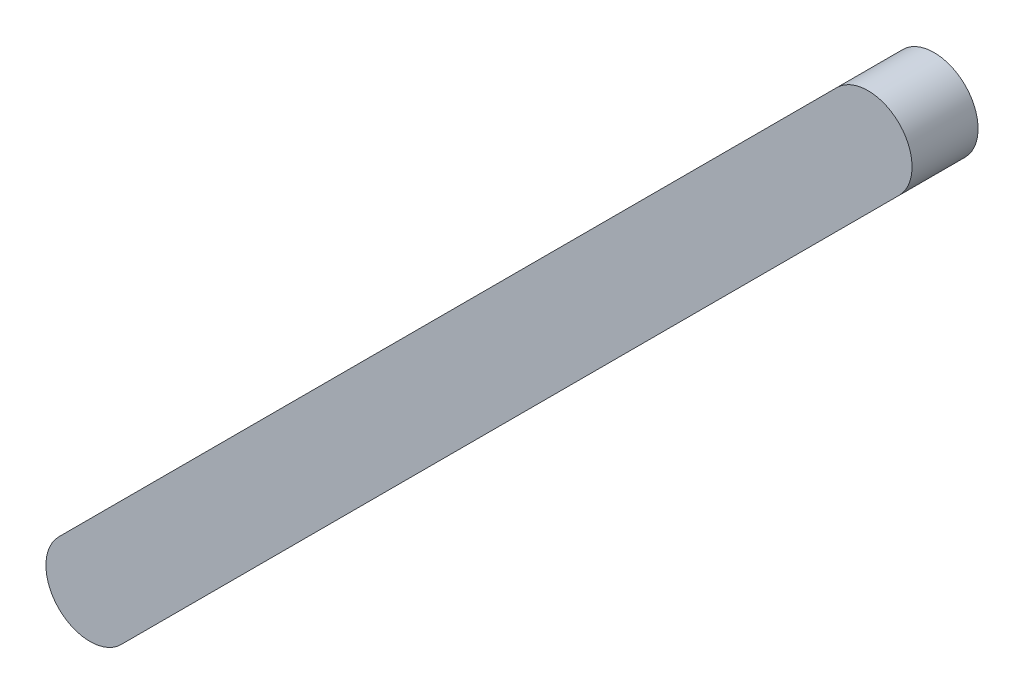
ISO-10303-21;
HEADER;
FILE_DESCRIPTION(('STEP AP214'),'2;1');
FILE_NAME('part.step','',(''),(''),'','','');
FILE_SCHEMA(('AUTOMOTIVE_DESIGN { 1 0 10303 214 1 1 1 1 }'));
ENDSEC;
DATA;
#1=APPLICATION_CONTEXT('core data for automotive mechanical design processes');
#2=APPLICATION_PROTOCOL_DEFINITION('international standard','automotive_design',2000,#1);
#3=PRODUCT_CONTEXT('',#1,'mechanical');
#4=PRODUCT('Part','Part','',(#3));
#5=PRODUCT_RELATED_PRODUCT_CATEGORY('part','',(#4));
#6=PRODUCT_DEFINITION_FORMATION('','',#4);
#7=PRODUCT_DEFINITION_CONTEXT('part definition',#1,'design');
#8=PRODUCT_DEFINITION('design','',#6,#7);
#9=PRODUCT_DEFINITION_SHAPE('','',#8);
#10=(LENGTH_UNIT() NAMED_UNIT(*) SI_UNIT(.MILLI.,.METRE.));
#11=(NAMED_UNIT(*) PLANE_ANGLE_UNIT() SI_UNIT($,.RADIAN.));
#12=(NAMED_UNIT(*) SI_UNIT($,.STERADIAN.) SOLID_ANGLE_UNIT());
#13=UNCERTAINTY_MEASURE_WITH_UNIT(LENGTH_MEASURE(1.E-05),#10,'distance_accuracy_value','');
#14=(GEOMETRIC_REPRESENTATION_CONTEXT(3) GLOBAL_UNCERTAINTY_ASSIGNED_CONTEXT((#13)) GLOBAL_UNIT_ASSIGNED_CONTEXT((#10,
#11,#12)) REPRESENTATION_CONTEXT('',''));
#15=CARTESIAN_POINT('',(0.,0.,0.));
#16=DIRECTION('',(0.,0.,1.));
#17=DIRECTION('',(1.,0.,0.));
#18=AXIS2_PLACEMENT_3D('',#15,#16,#17);
#19=CARTESIAN_POINT('',(0.,0.,3.));
#20=DIRECTION('',(0.,0.,-1.));
#21=DIRECTION('',(-1.,0.,0.));
#22=AXIS2_PLACEMENT_3D('',#19,#20,#21);
#23=CYLINDRICAL_SURFACE('',#22,2.);
#24=CARTESIAN_POINT('',(0.,0.,0.));
#25=DIRECTION('',(0.,0.,1.));
#26=DIRECTION('',(1.,0.,0.));
#27=AXIS2_PLACEMENT_3D('',#24,#25,#26);
#28=CIRCLE('',#27,2.);
#29=CARTESIAN_POINT('',(-1.4142135623731,1.41421356237309,0.));
#30=VERTEX_POINT('',#29);
#31=CARTESIAN_POINT('',(1.4142135623731,-1.41421356237309,0.));
#32=VERTEX_POINT('',#31);
#33=EDGE_CURVE('E100',#30,#32,#28,.T.);
#34=ORIENTED_EDGE('',*,*,#33,.T.);
#35=DIRECTION('',(0.,0.,-1.));
#36=VECTOR('',#35,1.);
#37=CARTESIAN_POINT('',(1.4142135623731,-1.41421356237309,3.));
#38=LINE('',#37,#36);
#39=CARTESIAN_POINT('',(1.4142135623731,-1.41421356237309,3.));
#40=VERTEX_POINT('',#39);
#41=EDGE_CURVE('E11',#40,#32,#38,.T.);
#42=ORIENTED_EDGE('',*,*,#41,.F.);
#43=CARTESIAN_POINT('',(0.,0.,3.));
#44=DIRECTION('',(0.,0.,1.));
#45=DIRECTION('',(1.,0.,0.));
#46=AXIS2_PLACEMENT_3D('',#43,#44,#45);
#47=CIRCLE('',#46,2.);
#48=CARTESIAN_POINT('',(-1.4142135623731,1.41421356237309,3.));
#49=VERTEX_POINT('',#48);
#50=EDGE_CURVE('E88',#49,#40,#47,.T.);
#51=ORIENTED_EDGE('',*,*,#50,.F.);
#52=DIRECTION('',(0.,0.,-1.));
#53=VECTOR('',#52,1.);
#54=CARTESIAN_POINT('',(-1.4142135623731,1.41421356237309,3.));
#55=LINE('',#54,#53);
#56=EDGE_CURVE('E96',#49,#30,#55,.T.);
#57=ORIENTED_EDGE('',*,*,#56,.T.);
#58=EDGE_LOOP('',(#34,#42,#51,#57));
#59=FACE_BOUND('',#58,.T.);
#60=ADVANCED_FACE('F37',(#59),#23,.T.);
#61=CARTESIAN_POINT('',(1.4142135623731,-1.41421356237309,3.));
#62=DIRECTION('',(-0.707106781186549,0.707106781186546,0.));
#63=DIRECTION('',(-0.707106781186546,-0.707106781186549,0.));
#64=AXIS2_PLACEMENT_3D('',#61,#62,#63);
#65=PLANE('',#64);
#66=DIRECTION('',(0.707106781186546,0.707106781186549,0.));
#67=VECTOR('',#66,1.);
#68=CARTESIAN_POINT('',(1.4142135623731,-1.41421356237309,0.));
#69=LINE('',#68,#67);
#70=CARTESIAN_POINT('',(36.7695526217004,33.9411254969544,0.));
#71=VERTEX_POINT('',#70);
#72=EDGE_CURVE('E92',#32,#71,#69,.T.);
#73=ORIENTED_EDGE('',*,*,#72,.T.);
#74=DIRECTION('',(0.,0.,-1.));
#75=VECTOR('',#74,1.);
#76=CARTESIAN_POINT('',(36.7695526217004,33.9411254969544,3.));
#77=LINE('',#76,#75);
#78=CARTESIAN_POINT('',(36.7695526217004,33.9411254969544,3.));
#79=VERTEX_POINT('',#78);
#80=EDGE_CURVE('E45',#79,#71,#77,.T.);
#81=ORIENTED_EDGE('',*,*,#80,.F.);
#82=DIRECTION('',(0.707106781186546,0.707106781186549,0.));
#83=VECTOR('',#82,1.);
#84=CARTESIAN_POINT('',(1.4142135623731,-1.41421356237309,3.));
#85=LINE('',#84,#83);
#86=EDGE_CURVE('E83',#40,#79,#85,.T.);
#87=ORIENTED_EDGE('',*,*,#86,.F.);
#88=ORIENTED_EDGE('',*,*,#41,.T.);
#89=EDGE_LOOP('',(#73,#81,#87,#88));
#90=FACE_BOUND('',#89,.T.);
#91=ADVANCED_FACE('F91',(#90),#65,.F.);
#92=CARTESIAN_POINT('',(35.3553390593273,35.3553390593274,3.));
#93=DIRECTION('',(0.,0.,-1.));
#94=DIRECTION('',(-1.,0.,0.));
#95=AXIS2_PLACEMENT_3D('',#92,#93,#94);
#96=CYLINDRICAL_SURFACE('',#95,2.);
#97=CARTESIAN_POINT('',(35.3553390593273,35.3553390593274,0.));
#98=DIRECTION('',(0.,0.,1.));
#99=DIRECTION('',(1.,0.,0.));
#100=AXIS2_PLACEMENT_3D('',#97,#98,#99);
#101=CIRCLE('',#100,2.);
#102=CARTESIAN_POINT('',(33.9411254969542,36.7695526217005,0.));
#103=VERTEX_POINT('',#102);
#104=EDGE_CURVE('E70',#71,#103,#101,.T.);
#105=ORIENTED_EDGE('',*,*,#104,.T.);
#106=DIRECTION('',(0.,0.,-1.));
#107=VECTOR('',#106,1.);
#108=CARTESIAN_POINT('',(33.9411254969542,36.7695526217005,3.));
#109=LINE('',#108,#107);
#110=CARTESIAN_POINT('',(33.9411254969542,36.7695526217005,3.));
#111=VERTEX_POINT('',#110);
#112=EDGE_CURVE('E93',#111,#103,#109,.T.);
#113=ORIENTED_EDGE('',*,*,#112,.F.);
#114=CARTESIAN_POINT('',(35.3553390593273,35.3553390593274,3.));
#115=DIRECTION('',(0.,0.,1.));
#116=DIRECTION('',(1.,0.,0.));
#117=AXIS2_PLACEMENT_3D('',#114,#115,#116);
#118=CIRCLE('',#117,2.);
#119=EDGE_CURVE('E86',#79,#111,#118,.T.);
#120=ORIENTED_EDGE('',*,*,#119,.F.);
#121=ORIENTED_EDGE('',*,*,#80,.T.);
#122=EDGE_LOOP('',(#105,#113,#120,#121));
#123=FACE_BOUND('',#122,.T.);
#124=ADVANCED_FACE('F94',(#123),#96,.T.);
#125=CARTESIAN_POINT('',(-1.4142135623731,1.41421356237309,3.));
#126=DIRECTION('',(0.707106781186549,-0.707106781186546,0.));
#127=DIRECTION('',(0.707106781186546,0.707106781186549,0.));
#128=AXIS2_PLACEMENT_3D('',#125,#126,#127);
#129=PLANE('',#128);
#130=DIRECTION('',(-0.707106781186546,-0.707106781186549,0.));
#131=VECTOR('',#130,1.);
#132=CARTESIAN_POINT('',(-1.4142135623731,1.41421356237309,0.));
#133=LINE('',#132,#131);
#134=EDGE_CURVE('E76',#103,#30,#133,.T.);
#135=ORIENTED_EDGE('',*,*,#134,.T.);
#136=ORIENTED_EDGE('',*,*,#56,.F.);
#137=DIRECTION('',(-0.707106781186546,-0.707106781186549,0.));
#138=VECTOR('',#137,1.);
#139=CARTESIAN_POINT('',(-1.4142135623731,1.41421356237309,3.));
#140=LINE('',#139,#138);
#141=EDGE_CURVE('E53',#111,#49,#140,.T.);
#142=ORIENTED_EDGE('',*,*,#141,.F.);
#143=ORIENTED_EDGE('',*,*,#112,.T.);
#144=EDGE_LOOP('',(#135,#136,#142,#143));
#145=FACE_BOUND('',#144,.T.);
#146=ADVANCED_FACE('F107',(#145),#129,.F.);
#147=CARTESIAN_POINT('',(0.,0.,3.));
#148=DIRECTION('',(0.,0.,1.));
#149=DIRECTION('',(1.,0.,0.));
#150=AXIS2_PLACEMENT_3D('',#147,#148,#149);
#151=PLANE('',#150);
#152=ORIENTED_EDGE('',*,*,#50,.T.);
#153=ORIENTED_EDGE('',*,*,#86,.T.);
#154=ORIENTED_EDGE('',*,*,#119,.T.);
#155=ORIENTED_EDGE('',*,*,#141,.T.);
#156=EDGE_LOOP('',(#152,#153,#154,#155));
#157=FACE_BOUND('',#156,.T.);
#158=ADVANCED_FACE('F84',(#157),#151,.T.);
#159=CARTESIAN_POINT('',(0.,0.,0.));
#160=DIRECTION('',(0.,0.,1.));
#161=DIRECTION('',(1.,0.,0.));
#162=AXIS2_PLACEMENT_3D('',#159,#160,#161);
#163=PLANE('',#162);
#164=ORIENTED_EDGE('',*,*,#33,.F.);
#165=ORIENTED_EDGE('',*,*,#134,.F.);
#166=ORIENTED_EDGE('',*,*,#104,.F.);
#167=ORIENTED_EDGE('',*,*,#72,.F.);
#168=EDGE_LOOP('',(#164,#165,#166,#167));
#169=FACE_BOUND('',#168,.T.);
#170=ADVANCED_FACE('F110',(#169),#163,.F.);
#171=CLOSED_SHELL('',(#60,#91,#124,#146,#158,#170));
#172=MANIFOLD_SOLID_BREP('B2',#171);
#173=ADVANCED_BREP_SHAPE_REPRESENTATION('',(#18,#172),#14);
#174=SHAPE_DEFINITION_REPRESENTATION(#9,#173);
ENDSEC;
END-ISO-10303-21;
